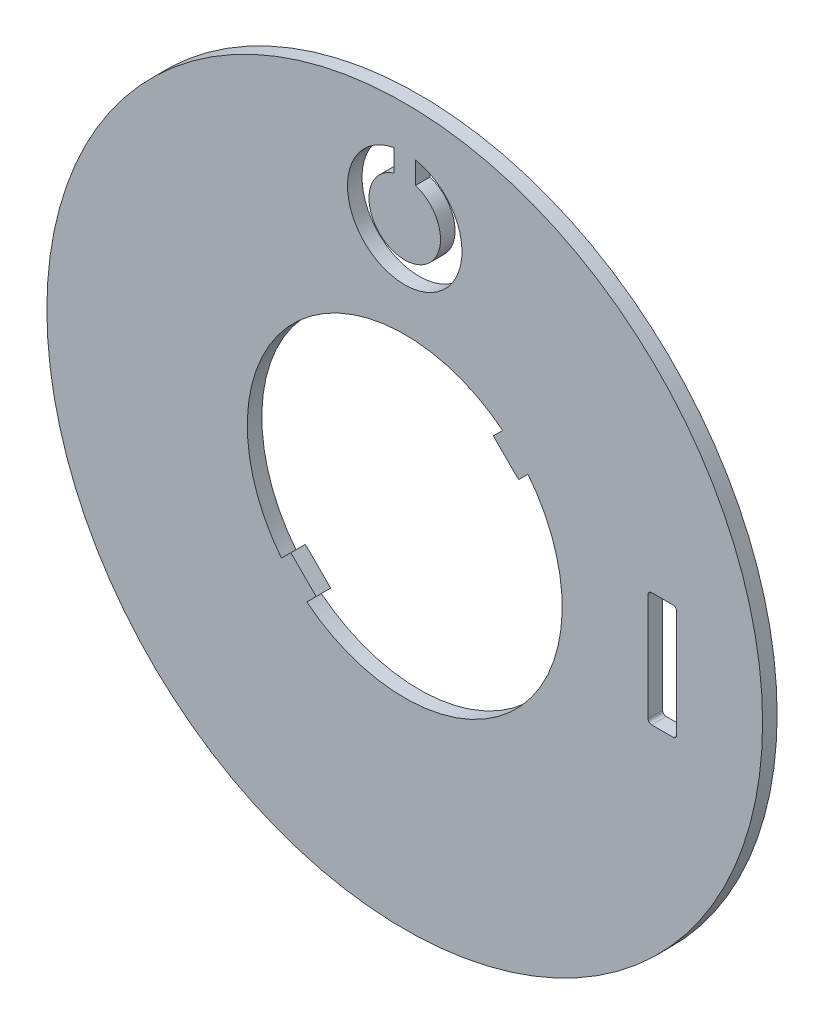
ISO-10303-21;
HEADER;
FILE_DESCRIPTION(('STEP AP214'),'2;1');
FILE_NAME('part.step','',(''),(''),'','','');
FILE_SCHEMA(('AUTOMOTIVE_DESIGN { 1 0 10303 214 1 1 1 1 }'));
ENDSEC;
DATA;
#1=APPLICATION_CONTEXT('core data for automotive mechanical design processes');
#2=APPLICATION_PROTOCOL_DEFINITION('international standard','automotive_design',2000,#1);
#3=PRODUCT_CONTEXT('',#1,'mechanical');
#4=PRODUCT('Part','Part','',(#3));
#5=PRODUCT_RELATED_PRODUCT_CATEGORY('part','',(#4));
#6=PRODUCT_DEFINITION_FORMATION('','',#4);
#7=PRODUCT_DEFINITION_CONTEXT('part definition',#1,'design');
#8=PRODUCT_DEFINITION('design','',#6,#7);
#9=PRODUCT_DEFINITION_SHAPE('','',#8);
#10=(LENGTH_UNIT() NAMED_UNIT(*) SI_UNIT(.MILLI.,.METRE.));
#11=(NAMED_UNIT(*) PLANE_ANGLE_UNIT() SI_UNIT($,.RADIAN.));
#12=(NAMED_UNIT(*) SI_UNIT($,.STERADIAN.) SOLID_ANGLE_UNIT());
#13=UNCERTAINTY_MEASURE_WITH_UNIT(LENGTH_MEASURE(1.E-05),#10,'distance_accuracy_value','');
#14=(GEOMETRIC_REPRESENTATION_CONTEXT(3) GLOBAL_UNCERTAINTY_ASSIGNED_CONTEXT((#13)) GLOBAL_UNIT_ASSIGNED_CONTEXT((#10,
#11,#12)) REPRESENTATION_CONTEXT('',''));
#15=CARTESIAN_POINT('',(0.,0.,0.));
#16=DIRECTION('',(0.,0.,1.));
#17=DIRECTION('',(1.,0.,0.));
#18=AXIS2_PLACEMENT_3D('',#15,#16,#17);
#19=CARTESIAN_POINT('',(0.,0.,0.));
#20=DIRECTION('',(0.,0.,1.));
#21=DIRECTION('',(1.,0.,0.));
#22=AXIS2_PLACEMENT_3D('',#19,#20,#21);
#23=PLANE('',#22);
#24=DIRECTION('',(0.,-1.,0.));
#25=VECTOR('',#24,1.);
#26=CARTESIAN_POINT('',(37.7500000006659,0.,0.));
#27=LINE('',#26,#25);
#28=CARTESIAN_POINT('',(37.7500000006659,83.7290584113755,0.));
#29=VERTEX_POINT('',#28);
#30=CARTESIAN_POINT('',(37.7500000006659,82.1848480035424,0.));
#31=VERTEX_POINT('',#30);
#32=EDGE_CURVE('E227',#29,#31,#27,.T.);
#33=ORIENTED_EDGE('',*,*,#32,.T.);
#34=CARTESIAN_POINT('',(37.0000000006659,79.8,0.));
#35=DIRECTION('',(0.,0.,1.));
#36=DIRECTION('',(1.,0.,0.));
#37=AXIS2_PLACEMENT_3D('',#34,#35,#36);
#38=CIRCLE('',#37,2.50000000000002);
#39=CARTESIAN_POINT('',(36.2500000006659,82.1848480035424,0.));
#40=VERTEX_POINT('',#39);
#41=EDGE_CURVE('E88',#40,#31,#38,.T.);
#42=ORIENTED_EDGE('',*,*,#41,.F.);
#43=DIRECTION('',(0.,1.,0.));
#44=VECTOR('',#43,1.);
#45=CARTESIAN_POINT('',(36.2500000006659,0.,0.));
#46=LINE('',#45,#44);
#47=CARTESIAN_POINT('',(36.2500000006659,83.7290584113755,0.));
#48=VERTEX_POINT('',#47);
#49=EDGE_CURVE('E217',#40,#48,#46,.T.);
#50=ORIENTED_EDGE('',*,*,#49,.T.);
#51=CARTESIAN_POINT('',(37.0000000006659,79.8,0.));
#52=DIRECTION('',(0.,0.,1.));
#53=DIRECTION('',(1.,0.,0.));
#54=AXIS2_PLACEMENT_3D('',#51,#52,#53);
#55=CIRCLE('',#54,4.00000000000001);
#56=EDGE_CURVE('E242',#48,#29,#55,.T.);
#57=ORIENTED_EDGE('',*,*,#56,.T.);
#58=EDGE_LOOP('',(#33,#42,#50,#57));
#59=FACE_BOUND('',#58,.T.);
#60=CARTESIAN_POINT('',(37.0000000006659,61.8,0.));
#61=DIRECTION('',(0.,0.,1.));
#62=DIRECTION('',(1.,0.,0.));
#63=AXIS2_PLACEMENT_3D('',#60,#61,#62);
#64=CIRCLE('',#63,25.);
#65=CARTESIAN_POINT('',(62.0000000006659,61.8,0.));
#66=VERTEX_POINT('',#65);
#67=EDGE_CURVE('E313',#66,#66,#64,.T.);
#68=ORIENTED_EDGE('',*,*,#67,.F.);
#69=EDGE_LOOP('',(#68));
#70=FACE_BOUND('',#69,.T.);
#71=DIRECTION('',(-0.707106781186551,-0.707106781186544,0.));
#72=VECTOR('',#71,1.);
#73=CARTESIAN_POINT('',(43.8942911172347,70.4620580695352,0.));
#74=LINE('',#73,#72);
#75=CARTESIAN_POINT('',(43.8439072822196,70.41167423452,0.));
#76=VERTEX_POINT('',#75);
#77=CARTESIAN_POINT('',(43.1871843360482,69.7549512883487,0.));
#78=VERTEX_POINT('',#77);
#79=EDGE_CURVE('E338',#76,#78,#74,.T.);
#80=ORIENTED_EDGE('',*,*,#79,.F.);
#81=CARTESIAN_POINT('',(37.0000000006659,61.8,0.));
#82=DIRECTION('',(0.,0.,1.));
#83=DIRECTION('',(1.,0.,0.));
#84=AXIS2_PLACEMENT_3D('',#81,#82,#83);
#85=CIRCLE('',#84,11.);
#86=CARTESIAN_POINT('',(28.3883257661459,54.9560927184463,0.));
#87=VERTEX_POINT('',#86);
#88=EDGE_CURVE('E318',#76,#87,#85,.T.);
#89=ORIENTED_EDGE('',*,*,#88,.T.);
#90=DIRECTION('',(-0.70710678118653,-0.707106781186565,0.));
#91=VECTOR('',#90,1.);
#92=CARTESIAN_POINT('',(29.0450487123172,55.6128156646177,0.));
#93=LINE('',#92,#91);
#94=CARTESIAN_POINT('',(29.0450487123172,55.6128156646177,0.));
#95=VERTEX_POINT('',#94);
#96=EDGE_CURVE('E360',#95,#87,#93,.T.);
#97=ORIENTED_EDGE('',*,*,#96,.F.);
#98=DIRECTION('',(-0.707106781186547,0.707106781186547,0.));
#99=VECTOR('',#98,1.);
#100=CARTESIAN_POINT('',(30.8128156652836,53.8450487116513,0.));
#101=LINE('',#100,#99);
#102=CARTESIAN_POINT('',(30.8128156652836,53.8450487116513,0.));
#103=VERTEX_POINT('',#102);
#104=EDGE_CURVE('E218',#103,#95,#101,.T.);
#105=ORIENTED_EDGE('',*,*,#104,.F.);
#106=DIRECTION('',(0.707106781186554,0.707106781186541,0.));
#107=VECTOR('',#106,1.);
#108=CARTESIAN_POINT('',(30.105708884097,53.1379419304648,0.));
#109=LINE('',#108,#107);
#110=CARTESIAN_POINT('',(30.1560927191122,53.18832576548,0.));
#111=VERTEX_POINT('',#110);
#112=EDGE_CURVE('E352',#111,#103,#109,.T.);
#113=ORIENTED_EDGE('',*,*,#112,.F.);
#114=CARTESIAN_POINT('',(45.6116742351859,68.6439072815537,0.));
#115=VERTEX_POINT('',#114);
#116=EDGE_CURVE('E321',#111,#115,#85,.T.);
#117=ORIENTED_EDGE('',*,*,#116,.T.);
#118=DIRECTION('',(0.707106781186537,0.707106781186558,0.));
#119=VECTOR('',#118,1.);
#120=CARTESIAN_POINT('',(44.9549512890146,67.9871843353823,0.));
#121=LINE('',#120,#119);
#122=CARTESIAN_POINT('',(44.9549512890146,67.9871843353823,0.));
#123=VERTEX_POINT('',#122);
#124=EDGE_CURVE('E332',#123,#115,#121,.T.);
#125=ORIENTED_EDGE('',*,*,#124,.F.);
#126=DIRECTION('',(0.707106781186547,-0.707106781186547,0.));
#127=VECTOR('',#126,1.);
#128=CARTESIAN_POINT('',(43.1871843360482,69.7549512883487,0.));
#129=LINE('',#128,#127);
#130=EDGE_CURVE('E340',#78,#123,#129,.T.);
#131=ORIENTED_EDGE('',*,*,#130,.F.);
#132=EDGE_LOOP('',(#80,#89,#97,#105,#113,#117,#125,#131));
#133=FACE_BOUND('',#132,.T.);
#134=DIRECTION('',(1.,0.,0.));
#135=VECTOR('',#134,1.);
#136=CARTESIAN_POINT('',(0.,57.8,0.));
#137=LINE('',#136,#135);
#138=CARTESIAN_POINT('',(54.2500000006659,57.8,0.));
#139=VERTEX_POINT('',#138);
#140=CARTESIAN_POINT('',(55.7500000006659,57.8,0.));
#141=VERTEX_POINT('',#140);
#142=EDGE_CURVE('E96',#139,#141,#137,.T.);
#143=ORIENTED_EDGE('',*,*,#142,.T.);
#144=CARTESIAN_POINT('',(55.7500000006659,58.05,0.));
#145=DIRECTION('',(0.,0.,1.));
#146=DIRECTION('',(1.,0.,0.));
#147=AXIS2_PLACEMENT_3D('',#144,#145,#146);
#148=CIRCLE('',#147,0.25);
#149=CARTESIAN_POINT('',(56.0000000006659,58.05,0.));
#150=VERTEX_POINT('',#149);
#151=EDGE_CURVE('E275',#141,#150,#148,.T.);
#152=ORIENTED_EDGE('',*,*,#151,.T.);
#153=DIRECTION('',(0.,1.,0.));
#154=VECTOR('',#153,1.);
#155=CARTESIAN_POINT('',(56.0000000006659,0.,0.));
#156=LINE('',#155,#154);
#157=CARTESIAN_POINT('',(56.0000000006659,65.55,0.));
#158=VERTEX_POINT('',#157);
#159=EDGE_CURVE('E278',#150,#158,#156,.T.);
#160=ORIENTED_EDGE('',*,*,#159,.T.);
#161=CARTESIAN_POINT('',(55.7500000006659,65.55,0.));
#162=DIRECTION('',(0.,0.,1.));
#163=DIRECTION('',(1.,0.,0.));
#164=AXIS2_PLACEMENT_3D('',#161,#162,#163);
#165=CIRCLE('',#164,0.25);
#166=CARTESIAN_POINT('',(55.7500000006659,65.8,0.));
#167=VERTEX_POINT('',#166);
#168=EDGE_CURVE('E281',#167,#158,#165,.F.);
#169=ORIENTED_EDGE('',*,*,#168,.F.);
#170=DIRECTION('',(1.,0.,0.));
#171=VECTOR('',#170,1.);
#172=CARTESIAN_POINT('',(0.,65.8,0.));
#173=LINE('',#172,#171);
#174=CARTESIAN_POINT('',(54.2500000006659,65.8,0.));
#175=VERTEX_POINT('',#174);
#176=EDGE_CURVE('E284',#175,#167,#173,.T.);
#177=ORIENTED_EDGE('',*,*,#176,.F.);
#178=CARTESIAN_POINT('',(54.2500000006659,65.55,0.));
#179=DIRECTION('',(0.,0.,1.));
#180=DIRECTION('',(1.,0.,0.));
#181=AXIS2_PLACEMENT_3D('',#178,#179,#180);
#182=CIRCLE('',#181,0.25);
#183=CARTESIAN_POINT('',(54.0000000006659,65.55,0.));
#184=VERTEX_POINT('',#183);
#185=EDGE_CURVE('E287',#184,#175,#182,.F.);
#186=ORIENTED_EDGE('',*,*,#185,.F.);
#187=DIRECTION('',(0.,1.,0.));
#188=VECTOR('',#187,1.);
#189=CARTESIAN_POINT('',(54.0000000006659,0.,0.));
#190=LINE('',#189,#188);
#191=CARTESIAN_POINT('',(54.0000000006659,58.05,0.));
#192=VERTEX_POINT('',#191);
#193=EDGE_CURVE('E290',#192,#184,#190,.T.);
#194=ORIENTED_EDGE('',*,*,#193,.F.);
#195=CARTESIAN_POINT('',(54.2500000006659,58.05,0.));
#196=DIRECTION('',(0.,0.,1.));
#197=DIRECTION('',(1.,0.,0.));
#198=AXIS2_PLACEMENT_3D('',#195,#196,#197);
#199=CIRCLE('',#198,0.25);
#200=EDGE_CURVE('E254',#139,#192,#199,.F.);
#201=ORIENTED_EDGE('',*,*,#200,.F.);
#202=EDGE_LOOP('',(#143,#152,#160,#169,#177,#186,#194,#201));
#203=FACE_BOUND('',#202,.T.);
#204=ADVANCED_FACE('F71',(#59,#70,#133,#203),#23,.F.);
#205=CARTESIAN_POINT('',(0.,0.,1.016));
#206=DIRECTION('',(0.,0.,1.));
#207=DIRECTION('',(1.,0.,0.));
#208=AXIS2_PLACEMENT_3D('',#205,#206,#207);
#209=PLANE('',#208);
#210=CARTESIAN_POINT('',(37.0000000006659,79.8,1.016));
#211=DIRECTION('',(0.,0.,1.));
#212=DIRECTION('',(1.,0.,0.));
#213=AXIS2_PLACEMENT_3D('',#210,#211,#212);
#214=CIRCLE('',#213,2.50000000000002);
#215=CARTESIAN_POINT('',(36.2500000006659,82.1848480035424,1.016));
#216=VERTEX_POINT('',#215);
#217=CARTESIAN_POINT('',(37.7500000006659,82.1848480035424,1.016));
#218=VERTEX_POINT('',#217);
#219=EDGE_CURVE('E222',#216,#218,#214,.T.);
#220=ORIENTED_EDGE('',*,*,#219,.T.);
#221=DIRECTION('',(0.,-1.,0.));
#222=VECTOR('',#221,1.);
#223=CARTESIAN_POINT('',(37.7500000006659,0.,1.016));
#224=LINE('',#223,#222);
#225=CARTESIAN_POINT('',(37.7500000006659,83.7290584113755,1.016));
#226=VERTEX_POINT('',#225);
#227=EDGE_CURVE('E235',#226,#218,#224,.T.);
#228=ORIENTED_EDGE('',*,*,#227,.F.);
#229=CARTESIAN_POINT('',(37.0000000006659,79.8,1.016));
#230=DIRECTION('',(0.,0.,1.));
#231=DIRECTION('',(1.,0.,0.));
#232=AXIS2_PLACEMENT_3D('',#229,#230,#231);
#233=CIRCLE('',#232,4.00000000000001);
#234=CARTESIAN_POINT('',(36.2500000006659,83.7290584113755,1.016));
#235=VERTEX_POINT('',#234);
#236=EDGE_CURVE('E233',#235,#226,#233,.T.);
#237=ORIENTED_EDGE('',*,*,#236,.F.);
#238=DIRECTION('',(0.,1.,0.));
#239=VECTOR('',#238,1.);
#240=CARTESIAN_POINT('',(36.2500000006659,0.,1.016));
#241=LINE('',#240,#239);
#242=EDGE_CURVE('E214',#216,#235,#241,.T.);
#243=ORIENTED_EDGE('',*,*,#242,.F.);
#244=EDGE_LOOP('',(#220,#228,#237,#243));
#245=FACE_BOUND('',#244,.T.);
#246=CARTESIAN_POINT('',(37.0000000006659,61.8,1.016));
#247=DIRECTION('',(0.,0.,1.));
#248=DIRECTION('',(1.,0.,0.));
#249=AXIS2_PLACEMENT_3D('',#246,#247,#248);
#250=CIRCLE('',#249,11.);
#251=CARTESIAN_POINT('',(43.8439072822196,70.41167423452,1.016));
#252=VERTEX_POINT('',#251);
#253=CARTESIAN_POINT('',(28.3883257661459,54.9560927184463,1.016));
#254=VERTEX_POINT('',#253);
#255=EDGE_CURVE('E309',#252,#254,#250,.T.);
#256=ORIENTED_EDGE('',*,*,#255,.F.);
#257=DIRECTION('',(-0.707106781186551,-0.707106781186544,0.));
#258=VECTOR('',#257,1.);
#259=CARTESIAN_POINT('',(43.8942911172347,70.4620580695352,1.016));
#260=LINE('',#259,#258);
#261=CARTESIAN_POINT('',(43.1871843360482,69.7549512883487,1.016));
#262=VERTEX_POINT('',#261);
#263=EDGE_CURVE('E329',#252,#262,#260,.T.);
#264=ORIENTED_EDGE('',*,*,#263,.T.);
#265=DIRECTION('',(0.707106781186547,-0.707106781186547,0.));
#266=VECTOR('',#265,1.);
#267=CARTESIAN_POINT('',(43.1871843360482,69.7549512883487,1.016));
#268=LINE('',#267,#266);
#269=CARTESIAN_POINT('',(44.9549512890146,67.9871843353823,1.016));
#270=VERTEX_POINT('',#269);
#271=EDGE_CURVE('E331',#262,#270,#268,.T.);
#272=ORIENTED_EDGE('',*,*,#271,.T.);
#273=DIRECTION('',(0.707106781186537,0.707106781186558,0.));
#274=VECTOR('',#273,1.);
#275=CARTESIAN_POINT('',(44.9549512890146,67.9871843353823,1.016));
#276=LINE('',#275,#274);
#277=CARTESIAN_POINT('',(45.6116742351859,68.6439072815537,1.016));
#278=VERTEX_POINT('',#277);
#279=EDGE_CURVE('E334',#270,#278,#276,.T.);
#280=ORIENTED_EDGE('',*,*,#279,.T.);
#281=CARTESIAN_POINT('',(30.1560927191122,53.18832576548,1.016));
#282=VERTEX_POINT('',#281);
#283=EDGE_CURVE('E312',#282,#278,#250,.T.);
#284=ORIENTED_EDGE('',*,*,#283,.F.);
#285=DIRECTION('',(0.707106781186554,0.707106781186541,0.));
#286=VECTOR('',#285,1.);
#287=CARTESIAN_POINT('',(30.105708884097,53.1379419304648,1.016));
#288=LINE('',#287,#286);
#289=CARTESIAN_POINT('',(30.8128156652836,53.8450487116513,1.016));
#290=VERTEX_POINT('',#289);
#291=EDGE_CURVE('E355',#282,#290,#288,.T.);
#292=ORIENTED_EDGE('',*,*,#291,.T.);
#293=DIRECTION('',(-0.707106781186547,0.707106781186547,0.));
#294=VECTOR('',#293,1.);
#295=CARTESIAN_POINT('',(30.8128156652836,53.8450487116513,1.016));
#296=LINE('',#295,#294);
#297=CARTESIAN_POINT('',(29.0450487123172,55.6128156646177,1.016));
#298=VERTEX_POINT('',#297);
#299=EDGE_CURVE('E348',#290,#298,#296,.T.);
#300=ORIENTED_EDGE('',*,*,#299,.T.);
#301=DIRECTION('',(-0.70710678118653,-0.707106781186565,0.));
#302=VECTOR('',#301,1.);
#303=CARTESIAN_POINT('',(29.0450487123172,55.6128156646177,1.016));
#304=LINE('',#303,#302);
#305=EDGE_CURVE('E351',#298,#254,#304,.T.);
#306=ORIENTED_EDGE('',*,*,#305,.T.);
#307=EDGE_LOOP('',(#256,#264,#272,#280,#284,#292,#300,#306));
#308=FACE_BOUND('',#307,.T.);
#309=CARTESIAN_POINT('',(37.0000000006659,61.8,1.016));
#310=DIRECTION('',(0.,0.,1.));
#311=DIRECTION('',(1.,0.,0.));
#312=AXIS2_PLACEMENT_3D('',#309,#310,#311);
#313=CIRCLE('',#312,25.);
#314=CARTESIAN_POINT('',(62.0000000006659,61.8,1.016));
#315=VERTEX_POINT('',#314);
#316=EDGE_CURVE('E314',#315,#315,#313,.T.);
#317=ORIENTED_EDGE('',*,*,#316,.T.);
#318=EDGE_LOOP('',(#317));
#319=FACE_BOUND('',#318,.T.);
#320=CARTESIAN_POINT('',(55.7500000006659,58.05,1.016));
#321=DIRECTION('',(0.,0.,1.));
#322=DIRECTION('',(1.,0.,0.));
#323=AXIS2_PLACEMENT_3D('',#320,#321,#322);
#324=CIRCLE('',#323,0.25);
#325=CARTESIAN_POINT('',(55.7500000006659,57.8,1.016));
#326=VERTEX_POINT('',#325);
#327=CARTESIAN_POINT('',(56.0000000006659,58.05,1.016));
#328=VERTEX_POINT('',#327);
#329=EDGE_CURVE('E253',#326,#328,#324,.T.);
#330=ORIENTED_EDGE('',*,*,#329,.F.);
#331=DIRECTION('',(1.,0.,0.));
#332=VECTOR('',#331,1.);
#333=CARTESIAN_POINT('',(0.,57.8,1.016));
#334=LINE('',#333,#332);
#335=CARTESIAN_POINT('',(54.2500000006659,57.8,1.016));
#336=VERTEX_POINT('',#335);
#337=EDGE_CURVE('E251',#336,#326,#334,.T.);
#338=ORIENTED_EDGE('',*,*,#337,.F.);
#339=CARTESIAN_POINT('',(54.2500000006659,58.05,1.016));
#340=DIRECTION('',(0.,0.,1.));
#341=DIRECTION('',(1.,0.,0.));
#342=AXIS2_PLACEMENT_3D('',#339,#340,#341);
#343=CIRCLE('',#342,0.25);
#344=CARTESIAN_POINT('',(54.0000000006659,58.05,1.016));
#345=VERTEX_POINT('',#344);
#346=EDGE_CURVE('E270',#336,#345,#343,.F.);
#347=ORIENTED_EDGE('',*,*,#346,.T.);
#348=DIRECTION('',(0.,1.,0.));
#349=VECTOR('',#348,1.);
#350=CARTESIAN_POINT('',(54.0000000006659,0.,1.016));
#351=LINE('',#350,#349);
#352=CARTESIAN_POINT('',(54.0000000006659,65.55,1.016));
#353=VERTEX_POINT('',#352);
#354=EDGE_CURVE('E267',#345,#353,#351,.T.);
#355=ORIENTED_EDGE('',*,*,#354,.T.);
#356=CARTESIAN_POINT('',(54.2500000006659,65.55,1.016));
#357=DIRECTION('',(0.,0.,1.));
#358=DIRECTION('',(1.,0.,0.));
#359=AXIS2_PLACEMENT_3D('',#356,#357,#358);
#360=CIRCLE('',#359,0.25);
#361=CARTESIAN_POINT('',(54.2500000006659,65.8,1.016));
#362=VERTEX_POINT('',#361);
#363=EDGE_CURVE('E264',#353,#362,#360,.F.);
#364=ORIENTED_EDGE('',*,*,#363,.T.);
#365=DIRECTION('',(1.,0.,0.));
#366=VECTOR('',#365,1.);
#367=CARTESIAN_POINT('',(0.,65.8,1.016));
#368=LINE('',#367,#366);
#369=CARTESIAN_POINT('',(55.7500000006659,65.8,1.016));
#370=VERTEX_POINT('',#369);
#371=EDGE_CURVE('E261',#362,#370,#368,.T.);
#372=ORIENTED_EDGE('',*,*,#371,.T.);
#373=CARTESIAN_POINT('',(55.7500000006659,65.55,1.016));
#374=DIRECTION('',(0.,0.,1.));
#375=DIRECTION('',(1.,0.,0.));
#376=AXIS2_PLACEMENT_3D('',#373,#374,#375);
#377=CIRCLE('',#376,0.25);
#378=CARTESIAN_POINT('',(56.0000000006659,65.55,1.016));
#379=VERTEX_POINT('',#378);
#380=EDGE_CURVE('E258',#370,#379,#377,.F.);
#381=ORIENTED_EDGE('',*,*,#380,.T.);
#382=DIRECTION('',(0.,1.,0.));
#383=VECTOR('',#382,1.);
#384=CARTESIAN_POINT('',(56.0000000006659,0.,1.016));
#385=LINE('',#384,#383);
#386=EDGE_CURVE('E256',#328,#379,#385,.T.);
#387=ORIENTED_EDGE('',*,*,#386,.F.);
#388=EDGE_LOOP('',(#330,#338,#347,#355,#364,#372,#381,#387));
#389=FACE_BOUND('',#388,.T.);
#390=ADVANCED_FACE('F230',(#245,#308,#319,#389),#209,.T.);
#391=CARTESIAN_POINT('',(37.0000000006659,61.8,1.016));
#392=DIRECTION('',(0.,0.,-1.));
#393=DIRECTION('',(-1.,0.,0.));
#394=AXIS2_PLACEMENT_3D('',#391,#392,#393);
#395=CYLINDRICAL_SURFACE('',#394,25.);
#396=ORIENTED_EDGE('',*,*,#316,.F.);
#397=EDGE_LOOP('',(#396));
#398=FACE_BOUND('',#397,.T.);
#399=ORIENTED_EDGE('',*,*,#67,.T.);
#400=EDGE_LOOP('',(#399));
#401=FACE_BOUND('',#400,.T.);
#402=ADVANCED_FACE('F417',(#398,#401),#395,.T.);
#403=CARTESIAN_POINT('',(37.0000000006659,61.8,1.016));
#404=DIRECTION('',(0.,0.,-1.));
#405=DIRECTION('',(-1.,0.,0.));
#406=AXIS2_PLACEMENT_3D('',#403,#404,#405);
#407=CYLINDRICAL_SURFACE('',#406,11.);
#408=ORIENTED_EDGE('',*,*,#116,.F.);
#409=DIRECTION('',(0.,0.,-1.));
#410=VECTOR('',#409,1.);
#411=CARTESIAN_POINT('',(30.1560927191122,53.18832576548,1.016));
#412=LINE('',#411,#410);
#413=EDGE_CURVE('E326',#282,#111,#412,.T.);
#414=ORIENTED_EDGE('',*,*,#413,.F.);
#415=ORIENTED_EDGE('',*,*,#283,.T.);
#416=DIRECTION('',(0.,0.,-1.));
#417=VECTOR('',#416,1.);
#418=CARTESIAN_POINT('',(45.6116742351859,68.6439072815537,1.016));
#419=LINE('',#418,#417);
#420=EDGE_CURVE('E80',#278,#115,#419,.T.);
#421=ORIENTED_EDGE('',*,*,#420,.T.);
#422=EDGE_LOOP('',(#408,#414,#415,#421));
#423=FACE_BOUND('',#422,.T.);
#424=ADVANCED_FACE('F391',(#423),#407,.F.);
#425=ORIENTED_EDGE('',*,*,#88,.F.);
#426=DIRECTION('',(0.,0.,-1.));
#427=VECTOR('',#426,1.);
#428=CARTESIAN_POINT('',(43.8439072822196,70.41167423452,1.016));
#429=LINE('',#428,#427);
#430=EDGE_CURVE('E12',#252,#76,#429,.T.);
#431=ORIENTED_EDGE('',*,*,#430,.F.);
#432=ORIENTED_EDGE('',*,*,#255,.T.);
#433=DIRECTION('',(0.,0.,-1.));
#434=VECTOR('',#433,1.);
#435=CARTESIAN_POINT('',(28.3883257661459,54.9560927184463,1.016));
#436=LINE('',#435,#434);
#437=EDGE_CURVE('E317',#254,#87,#436,.T.);
#438=ORIENTED_EDGE('',*,*,#437,.T.);
#439=EDGE_LOOP('',(#425,#431,#432,#438));
#440=FACE_BOUND('',#439,.T.);
#441=ADVANCED_FACE('F381',(#440),#407,.F.);
#442=CARTESIAN_POINT('',(29.0450487123172,55.6128156646177,1.016));
#443=DIRECTION('',(0.707106781186565,-0.70710678118653,0.));
#444=DIRECTION('',(0.70710678118653,0.707106781186565,0.));
#445=AXIS2_PLACEMENT_3D('',#442,#443,#444);
#446=PLANE('',#445);
#447=ORIENTED_EDGE('',*,*,#437,.F.);
#448=ORIENTED_EDGE('',*,*,#305,.F.);
#449=DIRECTION('',(0.,0.,-1.));
#450=VECTOR('',#449,1.);
#451=CARTESIAN_POINT('',(29.0450487123172,55.6128156646177,1.016));
#452=LINE('',#451,#450);
#453=EDGE_CURVE('E75',#298,#95,#452,.T.);
#454=ORIENTED_EDGE('',*,*,#453,.T.);
#455=ORIENTED_EDGE('',*,*,#96,.T.);
#456=EDGE_LOOP('',(#447,#448,#454,#455));
#457=FACE_BOUND('',#456,.T.);
#458=ADVANCED_FACE('F371',(#457),#446,.F.);
#459=CARTESIAN_POINT('',(30.105708884097,53.1379419304648,1.016));
#460=DIRECTION('',(-0.707106781186541,0.707106781186554,0.));
#461=DIRECTION('',(-0.707106781186554,-0.707106781186541,0.));
#462=AXIS2_PLACEMENT_3D('',#459,#460,#461);
#463=PLANE('',#462);
#464=ORIENTED_EDGE('',*,*,#291,.F.);
#465=ORIENTED_EDGE('',*,*,#413,.T.);
#466=ORIENTED_EDGE('',*,*,#112,.T.);
#467=DIRECTION('',(0.,0.,-1.));
#468=VECTOR('',#467,1.);
#469=CARTESIAN_POINT('',(30.8128156652836,53.8450487116513,1.016));
#470=LINE('',#469,#468);
#471=EDGE_CURVE('E357',#290,#103,#470,.T.);
#472=ORIENTED_EDGE('',*,*,#471,.F.);
#473=EDGE_LOOP('',(#464,#465,#466,#472));
#474=FACE_BOUND('',#473,.T.);
#475=ADVANCED_FACE('F389',(#474),#463,.F.);
#476=CARTESIAN_POINT('',(30.8128156652836,53.8450487116513,1.016));
#477=DIRECTION('',(-0.707106781186548,-0.707106781186548,0.));
#478=DIRECTION('',(0.707106781186548,-0.707106781186548,0.));
#479=AXIS2_PLACEMENT_3D('',#476,#477,#478);
#480=PLANE('',#479);
#481=ORIENTED_EDGE('',*,*,#104,.T.);
#482=ORIENTED_EDGE('',*,*,#453,.F.);
#483=ORIENTED_EDGE('',*,*,#299,.F.);
#484=ORIENTED_EDGE('',*,*,#471,.T.);
#485=EDGE_LOOP('',(#481,#482,#483,#484));
#486=FACE_BOUND('',#485,.T.);
#487=ADVANCED_FACE('F73',(#486),#480,.F.);
#488=CARTESIAN_POINT('',(43.8942911172347,70.4620580695352,1.016));
#489=DIRECTION('',(0.707106781186544,-0.707106781186551,0.));
#490=DIRECTION('',(0.707106781186551,0.707106781186544,0.));
#491=AXIS2_PLACEMENT_3D('',#488,#489,#490);
#492=PLANE('',#491);
#493=ORIENTED_EDGE('',*,*,#263,.F.);
#494=ORIENTED_EDGE('',*,*,#430,.T.);
#495=ORIENTED_EDGE('',*,*,#79,.T.);
#496=DIRECTION('',(0.,0.,-1.));
#497=VECTOR('',#496,1.);
#498=CARTESIAN_POINT('',(43.1871843360482,69.7549512883487,1.016));
#499=LINE('',#498,#497);
#500=EDGE_CURVE('E322',#262,#78,#499,.T.);
#501=ORIENTED_EDGE('',*,*,#500,.F.);
#502=EDGE_LOOP('',(#493,#494,#495,#501));
#503=FACE_BOUND('',#502,.T.);
#504=ADVANCED_FACE('F402',(#503),#492,.F.);
#505=CARTESIAN_POINT('',(43.1871843360482,69.7549512883487,1.016));
#506=DIRECTION('',(0.707106781186548,0.707106781186548,0.));
#507=DIRECTION('',(-0.707106781186548,0.707106781186548,0.));
#508=AXIS2_PLACEMENT_3D('',#505,#506,#507);
#509=PLANE('',#508);
#510=ORIENTED_EDGE('',*,*,#130,.T.);
#511=DIRECTION('',(0.,0.,-1.));
#512=VECTOR('',#511,1.);
#513=CARTESIAN_POINT('',(44.9549512890146,67.9871843353823,1.016));
#514=LINE('',#513,#512);
#515=EDGE_CURVE('E337',#270,#123,#514,.T.);
#516=ORIENTED_EDGE('',*,*,#515,.F.);
#517=ORIENTED_EDGE('',*,*,#271,.F.);
#518=ORIENTED_EDGE('',*,*,#500,.T.);
#519=EDGE_LOOP('',(#510,#516,#517,#518));
#520=FACE_BOUND('',#519,.T.);
#521=ADVANCED_FACE('F399',(#520),#509,.F.);
#522=CARTESIAN_POINT('',(44.9549512890146,67.9871843353823,1.016));
#523=DIRECTION('',(-0.707106781186558,0.707106781186537,0.));
#524=DIRECTION('',(-0.707106781186537,-0.707106781186558,0.));
#525=AXIS2_PLACEMENT_3D('',#522,#523,#524);
#526=PLANE('',#525);
#527=ORIENTED_EDGE('',*,*,#420,.F.);
#528=ORIENTED_EDGE('',*,*,#279,.F.);
#529=ORIENTED_EDGE('',*,*,#515,.T.);
#530=ORIENTED_EDGE('',*,*,#124,.T.);
#531=EDGE_LOOP('',(#527,#528,#529,#530));
#532=FACE_BOUND('',#531,.T.);
#533=ADVANCED_FACE('F394',(#532),#526,.F.);
#534=CARTESIAN_POINT('',(0.,57.8,1.016));
#535=DIRECTION('',(0.,1.,0.));
#536=DIRECTION('',(0.,0.,1.));
#537=AXIS2_PLACEMENT_3D('',#534,#535,#536);
#538=PLANE('',#537);
#539=ORIENTED_EDGE('',*,*,#142,.F.);
#540=DIRECTION('',(0.,0.,-1.));
#541=VECTOR('',#540,1.);
#542=CARTESIAN_POINT('',(54.2500000006659,57.8,1.016));
#543=LINE('',#542,#541);
#544=EDGE_CURVE('E273',#336,#139,#543,.T.);
#545=ORIENTED_EDGE('',*,*,#544,.F.);
#546=ORIENTED_EDGE('',*,*,#337,.T.);
#547=DIRECTION('',(0.,0.,-1.));
#548=VECTOR('',#547,1.);
#549=CARTESIAN_POINT('',(55.7500000006659,57.8,1.016));
#550=LINE('',#549,#548);
#551=EDGE_CURVE('E240',#326,#141,#550,.T.);
#552=ORIENTED_EDGE('',*,*,#551,.T.);
#553=EDGE_LOOP('',(#539,#545,#546,#552));
#554=FACE_BOUND('',#553,.T.);
#555=ADVANCED_FACE('F428',(#554),#538,.T.);
#556=CARTESIAN_POINT('',(55.7500000006659,58.05,1.016));
#557=DIRECTION('',(0.,0.,-1.));
#558=DIRECTION('',(-1.,0.,0.));
#559=AXIS2_PLACEMENT_3D('',#556,#557,#558);
#560=CYLINDRICAL_SURFACE('',#559,0.25);
#561=ORIENTED_EDGE('',*,*,#151,.F.);
#562=ORIENTED_EDGE('',*,*,#551,.F.);
#563=ORIENTED_EDGE('',*,*,#329,.T.);
#564=DIRECTION('',(0.,0.,-1.));
#565=VECTOR('',#564,1.);
#566=CARTESIAN_POINT('',(56.0000000006659,58.05,1.016));
#567=LINE('',#566,#565);
#568=EDGE_CURVE('E306',#328,#150,#567,.T.);
#569=ORIENTED_EDGE('',*,*,#568,.T.);
#570=EDGE_LOOP('',(#561,#562,#563,#569));
#571=FACE_BOUND('',#570,.T.);
#572=ADVANCED_FACE('F432',(#571),#560,.F.);
#573=CARTESIAN_POINT('',(56.0000000006659,0.,1.016));
#574=DIRECTION('',(-1.,0.,0.));
#575=DIRECTION('',(0.,0.,1.));
#576=AXIS2_PLACEMENT_3D('',#573,#574,#575);
#577=PLANE('',#576);
#578=ORIENTED_EDGE('',*,*,#159,.F.);
#579=ORIENTED_EDGE('',*,*,#568,.F.);
#580=ORIENTED_EDGE('',*,*,#386,.T.);
#581=DIRECTION('',(0.,0.,-1.));
#582=VECTOR('',#581,1.);
#583=CARTESIAN_POINT('',(56.0000000006659,65.55,1.016));
#584=LINE('',#583,#582);
#585=EDGE_CURVE('E304',#379,#158,#584,.T.);
#586=ORIENTED_EDGE('',*,*,#585,.T.);
#587=EDGE_LOOP('',(#578,#579,#580,#586));
#588=FACE_BOUND('',#587,.T.);
#589=ADVANCED_FACE('F436',(#588),#577,.T.);
#590=CARTESIAN_POINT('',(55.7500000006659,65.55,1.016));
#591=DIRECTION('',(0.,0.,-1.));
#592=DIRECTION('',(-1.,0.,0.));
#593=AXIS2_PLACEMENT_3D('',#590,#591,#592);
#594=CYLINDRICAL_SURFACE('',#593,0.25);
#595=ORIENTED_EDGE('',*,*,#168,.T.);
#596=ORIENTED_EDGE('',*,*,#585,.F.);
#597=ORIENTED_EDGE('',*,*,#380,.F.);
#598=DIRECTION('',(0.,0.,-1.));
#599=VECTOR('',#598,1.);
#600=CARTESIAN_POINT('',(55.7500000006659,65.8,1.016));
#601=LINE('',#600,#599);
#602=EDGE_CURVE('E302',#370,#167,#601,.T.);
#603=ORIENTED_EDGE('',*,*,#602,.T.);
#604=EDGE_LOOP('',(#595,#596,#597,#603));
#605=FACE_BOUND('',#604,.T.);
#606=ADVANCED_FACE('F442',(#605),#594,.F.);
#607=CARTESIAN_POINT('',(0.,65.8,1.016));
#608=DIRECTION('',(0.,1.,0.));
#609=DIRECTION('',(0.,0.,1.));
#610=AXIS2_PLACEMENT_3D('',#607,#608,#609);
#611=PLANE('',#610);
#612=ORIENTED_EDGE('',*,*,#176,.T.);
#613=ORIENTED_EDGE('',*,*,#602,.F.);
#614=ORIENTED_EDGE('',*,*,#371,.F.);
#615=DIRECTION('',(0.,0.,-1.));
#616=VECTOR('',#615,1.);
#617=CARTESIAN_POINT('',(54.2500000006659,65.8,1.016));
#618=LINE('',#617,#616);
#619=EDGE_CURVE('E300',#362,#175,#618,.T.);
#620=ORIENTED_EDGE('',*,*,#619,.T.);
#621=EDGE_LOOP('',(#612,#613,#614,#620));
#622=FACE_BOUND('',#621,.T.);
#623=ADVANCED_FACE('F446',(#622),#611,.F.);
#624=CARTESIAN_POINT('',(54.2500000006659,65.55,1.016));
#625=DIRECTION('',(0.,0.,-1.));
#626=DIRECTION('',(-1.,0.,0.));
#627=AXIS2_PLACEMENT_3D('',#624,#625,#626);
#628=CYLINDRICAL_SURFACE('',#627,0.25);
#629=ORIENTED_EDGE('',*,*,#185,.T.);
#630=ORIENTED_EDGE('',*,*,#619,.F.);
#631=ORIENTED_EDGE('',*,*,#363,.F.);
#632=DIRECTION('',(0.,0.,-1.));
#633=VECTOR('',#632,1.);
#634=CARTESIAN_POINT('',(54.0000000006659,65.55,1.016));
#635=LINE('',#634,#633);
#636=EDGE_CURVE('E298',#353,#184,#635,.T.);
#637=ORIENTED_EDGE('',*,*,#636,.T.);
#638=EDGE_LOOP('',(#629,#630,#631,#637));
#639=FACE_BOUND('',#638,.T.);
#640=ADVANCED_FACE('F450',(#639),#628,.F.);
#641=CARTESIAN_POINT('',(54.0000000006659,0.,1.016));
#642=DIRECTION('',(-1.,0.,0.));
#643=DIRECTION('',(0.,0.,1.));
#644=AXIS2_PLACEMENT_3D('',#641,#642,#643);
#645=PLANE('',#644);
#646=ORIENTED_EDGE('',*,*,#193,.T.);
#647=ORIENTED_EDGE('',*,*,#636,.F.);
#648=ORIENTED_EDGE('',*,*,#354,.F.);
#649=DIRECTION('',(0.,0.,-1.));
#650=VECTOR('',#649,1.);
#651=CARTESIAN_POINT('',(54.0000000006659,58.05,1.016));
#652=LINE('',#651,#650);
#653=EDGE_CURVE('E296',#345,#192,#652,.T.);
#654=ORIENTED_EDGE('',*,*,#653,.T.);
#655=EDGE_LOOP('',(#646,#647,#648,#654));
#656=FACE_BOUND('',#655,.T.);
#657=ADVANCED_FACE('F454',(#656),#645,.F.);
#658=CARTESIAN_POINT('',(54.2500000006659,58.05,1.016));
#659=DIRECTION('',(0.,0.,-1.));
#660=DIRECTION('',(-1.,0.,0.));
#661=AXIS2_PLACEMENT_3D('',#658,#659,#660);
#662=CYLINDRICAL_SURFACE('',#661,0.25);
#663=ORIENTED_EDGE('',*,*,#200,.T.);
#664=ORIENTED_EDGE('',*,*,#653,.F.);
#665=ORIENTED_EDGE('',*,*,#346,.F.);
#666=ORIENTED_EDGE('',*,*,#544,.T.);
#667=EDGE_LOOP('',(#663,#664,#665,#666));
#668=FACE_BOUND('',#667,.T.);
#669=ADVANCED_FACE('F458',(#668),#662,.F.);
#670=CARTESIAN_POINT('',(37.0000000006659,79.8,1.016));
#671=DIRECTION('',(0.,0.,-1.));
#672=DIRECTION('',(-1.,0.,0.));
#673=AXIS2_PLACEMENT_3D('',#670,#671,#672);
#674=CYLINDRICAL_SURFACE('',#673,2.50000000000002);
#675=ORIENTED_EDGE('',*,*,#41,.T.);
#676=DIRECTION('',(0.,0.,-1.));
#677=VECTOR('',#676,1.);
#678=CARTESIAN_POINT('',(37.7500000006659,82.1848480035424,1.016));
#679=LINE('',#678,#677);
#680=EDGE_CURVE('E224',#218,#31,#679,.T.);
#681=ORIENTED_EDGE('',*,*,#680,.F.);
#682=ORIENTED_EDGE('',*,*,#219,.F.);
#683=DIRECTION('',(0.,0.,-1.));
#684=VECTOR('',#683,1.);
#685=CARTESIAN_POINT('',(36.2500000006659,82.1848480035424,1.016));
#686=LINE('',#685,#684);
#687=EDGE_CURVE('E210',#216,#40,#686,.T.);
#688=ORIENTED_EDGE('',*,*,#687,.T.);
#689=EDGE_LOOP('',(#675,#681,#682,#688));
#690=FACE_BOUND('',#689,.T.);
#691=ADVANCED_FACE('F223',(#690),#674,.T.);
#692=CARTESIAN_POINT('',(36.2500000006659,0.,1.016));
#693=DIRECTION('',(-1.,0.,0.));
#694=DIRECTION('',(0.,0.,1.));
#695=AXIS2_PLACEMENT_3D('',#692,#693,#694);
#696=PLANE('',#695);
#697=ORIENTED_EDGE('',*,*,#49,.F.);
#698=ORIENTED_EDGE('',*,*,#687,.F.);
#699=ORIENTED_EDGE('',*,*,#242,.T.);
#700=DIRECTION('',(0.,0.,-1.));
#701=VECTOR('',#700,1.);
#702=CARTESIAN_POINT('',(36.2500000006659,83.7290584113755,1.016));
#703=LINE('',#702,#701);
#704=EDGE_CURVE('E219',#235,#48,#703,.T.);
#705=ORIENTED_EDGE('',*,*,#704,.T.);
#706=EDGE_LOOP('',(#697,#698,#699,#705));
#707=FACE_BOUND('',#706,.T.);
#708=ADVANCED_FACE('F212',(#707),#696,.T.);
#709=CARTESIAN_POINT('',(37.0000000006659,79.8,1.016));
#710=DIRECTION('',(0.,0.,-1.));
#711=DIRECTION('',(-1.,0.,0.));
#712=AXIS2_PLACEMENT_3D('',#709,#710,#711);
#713=CYLINDRICAL_SURFACE('',#712,4.00000000000001);
#714=ORIENTED_EDGE('',*,*,#56,.F.);
#715=ORIENTED_EDGE('',*,*,#704,.F.);
#716=ORIENTED_EDGE('',*,*,#236,.T.);
#717=DIRECTION('',(0.,0.,-1.));
#718=VECTOR('',#717,1.);
#719=CARTESIAN_POINT('',(37.7500000006659,83.7290584113755,1.016));
#720=LINE('',#719,#718);
#721=EDGE_CURVE('E248',#226,#29,#720,.T.);
#722=ORIENTED_EDGE('',*,*,#721,.T.);
#723=EDGE_LOOP('',(#714,#715,#716,#722));
#724=FACE_BOUND('',#723,.T.);
#725=ADVANCED_FACE('F467',(#724),#713,.F.);
#726=CARTESIAN_POINT('',(37.7500000006659,0.,1.016));
#727=DIRECTION('',(1.,0.,0.));
#728=DIRECTION('',(0.,0.,-1.));
#729=AXIS2_PLACEMENT_3D('',#726,#727,#728);
#730=PLANE('',#729);
#731=ORIENTED_EDGE('',*,*,#32,.F.);
#732=ORIENTED_EDGE('',*,*,#721,.F.);
#733=ORIENTED_EDGE('',*,*,#227,.T.);
#734=ORIENTED_EDGE('',*,*,#680,.T.);
#735=EDGE_LOOP('',(#731,#732,#733,#734));
#736=FACE_BOUND('',#735,.T.);
#737=ADVANCED_FACE('F470',(#736),#730,.T.);
#738=CLOSED_SHELL('',(#204,#390,#402,#424,#441,#458,#475,#487,#504,#521,#533,#555,#572,#589,
#606,#623,#640,#657,#669,#691,#708,#725,#737));
#739=MANIFOLD_SOLID_BREP('B2',#738);
#740=ADVANCED_BREP_SHAPE_REPRESENTATION('',(#18,#739),#14);
#741=SHAPE_DEFINITION_REPRESENTATION(#9,#740);
ENDSEC;
END-ISO-10303-21;
